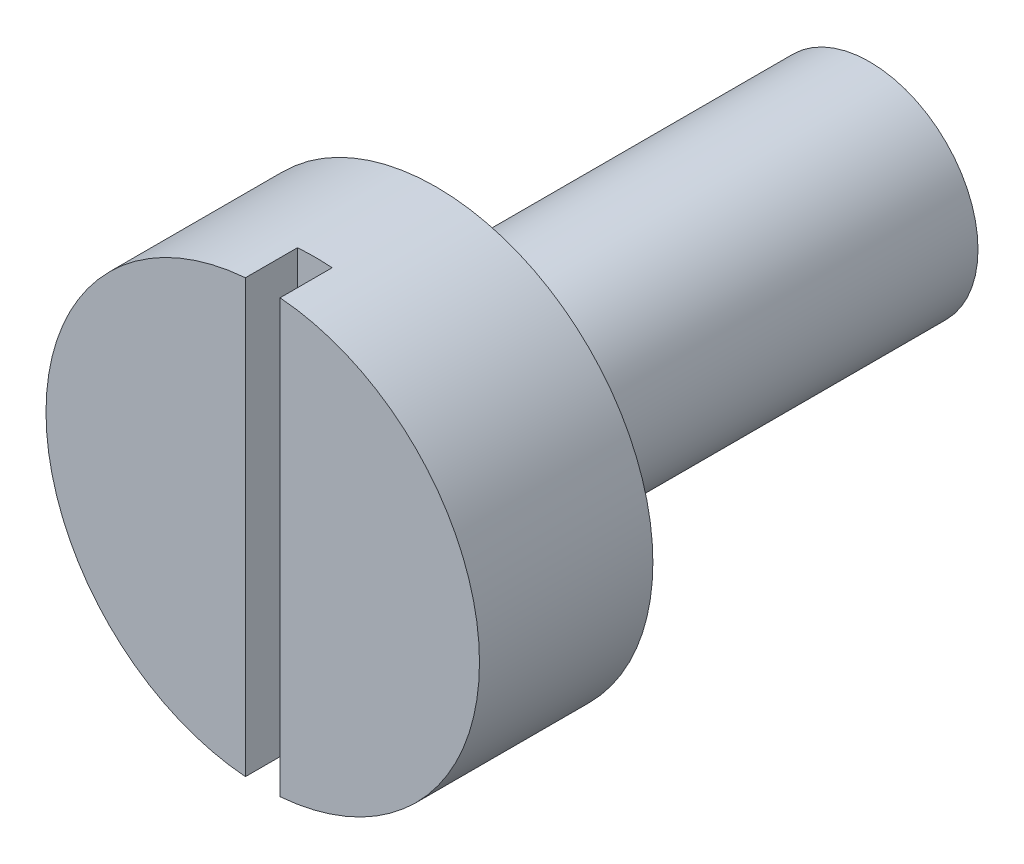
ISO-10303-21;
HEADER;
FILE_DESCRIPTION(('STEP AP214'),'2;1');
FILE_NAME('part.step','',(''),(''),'','','');
FILE_SCHEMA(('AUTOMOTIVE_DESIGN { 1 0 10303 214 1 1 1 1 }'));
ENDSEC;
DATA;
#1=APPLICATION_CONTEXT('core data for automotive mechanical design processes');
#2=APPLICATION_PROTOCOL_DEFINITION('international standard','automotive_design',2000,#1);
#3=PRODUCT_CONTEXT('',#1,'mechanical');
#4=PRODUCT('Part','Part','',(#3));
#5=PRODUCT_RELATED_PRODUCT_CATEGORY('part','',(#4));
#6=PRODUCT_DEFINITION_FORMATION('','',#4);
#7=PRODUCT_DEFINITION_CONTEXT('part definition',#1,'design');
#8=PRODUCT_DEFINITION('design','',#6,#7);
#9=PRODUCT_DEFINITION_SHAPE('','',#8);
#10=(LENGTH_UNIT() NAMED_UNIT(*) SI_UNIT(.MILLI.,.METRE.));
#11=(NAMED_UNIT(*) PLANE_ANGLE_UNIT() SI_UNIT($,.RADIAN.));
#12=(NAMED_UNIT(*) SI_UNIT($,.STERADIAN.) SOLID_ANGLE_UNIT());
#13=UNCERTAINTY_MEASURE_WITH_UNIT(LENGTH_MEASURE(1.E-05),#10,'distance_accuracy_value','');
#14=(GEOMETRIC_REPRESENTATION_CONTEXT(3) GLOBAL_UNCERTAINTY_ASSIGNED_CONTEXT((#13)) GLOBAL_UNIT_ASSIGNED_CONTEXT((#10,
#11,#12)) REPRESENTATION_CONTEXT('',''));
#15=CARTESIAN_POINT('',(0.,0.,0.));
#16=DIRECTION('',(0.,0.,1.));
#17=DIRECTION('',(1.,0.,0.));
#18=AXIS2_PLACEMENT_3D('',#15,#16,#17);
#19=CARTESIAN_POINT('',(0.,0.,9.));
#20=DIRECTION('',(0.,0.,1.));
#21=DIRECTION('',(1.,0.,0.));
#22=AXIS2_PLACEMENT_3D('',#19,#20,#21);
#23=PLANE('',#22);
#24=DIRECTION('',(0.,-1.,0.));
#25=VECTOR('',#24,1.);
#26=CARTESIAN_POINT('',(-0.4,0.,9.));
#27=LINE('',#26,#25);
#28=CARTESIAN_POINT('',(-0.400000000000002,4.98397431775084,9.));
#29=VERTEX_POINT('',#28);
#30=CARTESIAN_POINT('',(-0.399999999999999,-4.98397431775085,9.));
#31=VERTEX_POINT('',#30);
#32=EDGE_CURVE('E77',#29,#31,#27,.T.);
#33=ORIENTED_EDGE('',*,*,#32,.F.);
#34=CARTESIAN_POINT('',(0.,0.,9.));
#35=DIRECTION('',(0.,0.,1.));
#36=DIRECTION('',(1.,0.,0.));
#37=AXIS2_PLACEMENT_3D('',#34,#35,#36);
#38=CIRCLE('',#37,5.);
#39=EDGE_CURVE('E89',#29,#31,#38,.T.);
#40=ORIENTED_EDGE('',*,*,#39,.T.);
#41=EDGE_LOOP('',(#33,#40));
#42=FACE_BOUND('',#41,.T.);
#43=ADVANCED_FACE('F29',(#42),#23,.T.);
#44=CARTESIAN_POINT('',(0.,0.,5.));
#45=DIRECTION('',(0.,0.,-1.));
#46=DIRECTION('',(-1.,0.,0.));
#47=AXIS2_PLACEMENT_3D('',#44,#45,#46);
#48=CYLINDRICAL_SURFACE('',#47,2.5);
#49=CARTESIAN_POINT('',(0.,0.,5.));
#50=DIRECTION('',(0.,0.,1.));
#51=DIRECTION('',(1.,0.,0.));
#52=AXIS2_PLACEMENT_3D('',#49,#50,#51);
#53=CIRCLE('',#52,2.5);
#54=CARTESIAN_POINT('',(2.5,0.,5.));
#55=VERTEX_POINT('',#54);
#56=EDGE_CURVE('E78',#55,#55,#53,.T.);
#57=ORIENTED_EDGE('',*,*,#56,.F.);
#58=EDGE_LOOP('',(#57));
#59=FACE_BOUND('',#58,.T.);
#60=CARTESIAN_POINT('',(0.,0.,-5.));
#61=DIRECTION('',(0.,0.,1.));
#62=DIRECTION('',(1.,0.,0.));
#63=AXIS2_PLACEMENT_3D('',#60,#61,#62);
#64=CIRCLE('',#63,2.5);
#65=CARTESIAN_POINT('',(2.5,0.,-5.));
#66=VERTEX_POINT('',#65);
#67=EDGE_CURVE('E93',#66,#66,#64,.T.);
#68=ORIENTED_EDGE('',*,*,#67,.T.);
#69=EDGE_LOOP('',(#68));
#70=FACE_BOUND('',#69,.T.);
#71=ADVANCED_FACE('F31',(#59,#70),#48,.T.);
#72=CARTESIAN_POINT('',(0.,0.,-5.));
#73=DIRECTION('',(0.,0.,1.));
#74=DIRECTION('',(1.,0.,0.));
#75=AXIS2_PLACEMENT_3D('',#72,#73,#74);
#76=PLANE('',#75);
#77=ORIENTED_EDGE('',*,*,#67,.F.);
#78=EDGE_LOOP('',(#77));
#79=FACE_BOUND('',#78,.T.);
#80=ADVANCED_FACE('F118',(#79),#76,.F.);
#81=CARTESIAN_POINT('',(0.,0.,5.));
#82=DIRECTION('',(0.,0.,1.));
#83=DIRECTION('',(1.,0.,0.));
#84=AXIS2_PLACEMENT_3D('',#81,#82,#83);
#85=PLANE('',#84);
#86=CARTESIAN_POINT('',(0.,0.,5.));
#87=DIRECTION('',(0.,0.,1.));
#88=DIRECTION('',(1.,0.,0.));
#89=AXIS2_PLACEMENT_3D('',#86,#87,#88);
#90=CIRCLE('',#89,5.);
#91=CARTESIAN_POINT('',(5.,0.,5.));
#92=VERTEX_POINT('',#91);
#93=EDGE_CURVE('E90',#92,#92,#90,.T.);
#94=ORIENTED_EDGE('',*,*,#93,.F.);
#95=EDGE_LOOP('',(#94));
#96=FACE_BOUND('',#95,.T.);
#97=ORIENTED_EDGE('',*,*,#56,.T.);
#98=EDGE_LOOP('',(#97));
#99=FACE_BOUND('',#98,.T.);
#100=ADVANCED_FACE('F128',(#96,#99),#85,.F.);
#101=CARTESIAN_POINT('',(0.,0.,9.));
#102=DIRECTION('',(0.,0.,-1.));
#103=DIRECTION('',(-1.,0.,0.));
#104=AXIS2_PLACEMENT_3D('',#101,#102,#103);
#105=CYLINDRICAL_SURFACE('',#104,5.);
#106=ORIENTED_EDGE('',*,*,#39,.F.);
#107=DIRECTION('',(0.,0.,-1.));
#108=VECTOR('',#107,1.);
#109=CARTESIAN_POINT('',(-0.400000000000002,4.98397431775085,9.));
#110=LINE('',#109,#108);
#111=CARTESIAN_POINT('',(-0.400000000000002,4.98397431775084,7.8));
#112=VERTEX_POINT('',#111);
#113=EDGE_CURVE('E95',#29,#112,#110,.T.);
#114=ORIENTED_EDGE('',*,*,#113,.T.);
#115=CARTESIAN_POINT('',(0.,0.,7.8));
#116=DIRECTION('',(0.,0.,-1.));
#117=DIRECTION('',(-1.,0.,0.));
#118=AXIS2_PLACEMENT_3D('',#115,#116,#117);
#119=CIRCLE('',#118,5.);
#120=CARTESIAN_POINT('',(0.400000000000001,4.98397431775084,7.8));
#121=VERTEX_POINT('',#120);
#122=EDGE_CURVE('E11',#112,#121,#119,.T.);
#123=ORIENTED_EDGE('',*,*,#122,.T.);
#124=DIRECTION('',(0.,0.,-1.));
#125=VECTOR('',#124,1.);
#126=CARTESIAN_POINT('',(0.400000000000001,4.98397431775085,9.));
#127=LINE('',#126,#125);
#128=CARTESIAN_POINT('',(0.400000000000001,4.98397431775084,9.));
#129=VERTEX_POINT('',#128);
#130=EDGE_CURVE('E72',#121,#129,#127,.F.);
#131=ORIENTED_EDGE('',*,*,#130,.T.);
#132=CARTESIAN_POINT('',(0.400000000000001,-4.98397431775085,9.));
#133=VERTEX_POINT('',#132);
#134=EDGE_CURVE('E84',#133,#129,#38,.T.);
#135=ORIENTED_EDGE('',*,*,#134,.F.);
#136=DIRECTION('',(0.,0.,-1.));
#137=VECTOR('',#136,1.);
#138=CARTESIAN_POINT('',(0.400000000000001,-4.98397431775085,9.));
#139=LINE('',#138,#137);
#140=CARTESIAN_POINT('',(0.400000000000001,-4.98397431775084,7.8));
#141=VERTEX_POINT('',#140);
#142=EDGE_CURVE('E44',#133,#141,#139,.T.);
#143=ORIENTED_EDGE('',*,*,#142,.T.);
#144=CARTESIAN_POINT('',(-0.399999999999999,-4.98397431775084,7.8));
#145=VERTEX_POINT('',#144);
#146=EDGE_CURVE('E33',#141,#145,#119,.T.);
#147=ORIENTED_EDGE('',*,*,#146,.T.);
#148=DIRECTION('',(0.,0.,-1.));
#149=VECTOR('',#148,1.);
#150=CARTESIAN_POINT('',(-0.399999999999999,-4.98397431775085,9.));
#151=LINE('',#150,#149);
#152=EDGE_CURVE('E52',#145,#31,#151,.F.);
#153=ORIENTED_EDGE('',*,*,#152,.T.);
#154=EDGE_LOOP('',(#106,#114,#123,#131,#135,#143,#147,#153));
#155=FACE_BOUND('',#154,.T.);
#156=ORIENTED_EDGE('',*,*,#93,.T.);
#157=EDGE_LOOP('',(#156));
#158=FACE_BOUND('',#157,.T.);
#159=ADVANCED_FACE('F82',(#155,#158),#105,.T.);
#160=DIRECTION('',(0.,1.,0.));
#161=VECTOR('',#160,1.);
#162=CARTESIAN_POINT('',(0.400000000000001,0.,9.));
#163=LINE('',#162,#161);
#164=EDGE_CURVE('E69',#133,#129,#163,.T.);
#165=ORIENTED_EDGE('',*,*,#164,.F.);
#166=ORIENTED_EDGE('',*,*,#134,.T.);
#167=EDGE_LOOP('',(#165,#166));
#168=FACE_BOUND('',#167,.T.);
#169=ADVANCED_FACE('F88',(#168),#23,.T.);
#170=CARTESIAN_POINT('',(-0.399999999999999,-5.46612334920244,7.8));
#171=DIRECTION('',(0.,0.,-1.));
#172=DIRECTION('',(-1.,0.,0.));
#173=AXIS2_PLACEMENT_3D('',#170,#171,#172);
#174=PLANE('',#173);
#175=DIRECTION('',(0.,-1.,0.));
#176=VECTOR('',#175,1.);
#177=CARTESIAN_POINT('',(-0.399999999999999,-5.46612334920244,7.8));
#178=LINE('',#177,#176);
#179=EDGE_CURVE('E106',#112,#145,#178,.T.);
#180=ORIENTED_EDGE('',*,*,#179,.T.);
#181=ORIENTED_EDGE('',*,*,#146,.F.);
#182=DIRECTION('',(0.,1.,0.));
#183=VECTOR('',#182,1.);
#184=CARTESIAN_POINT('',(0.400000000000001,-5.46612334920244,7.8));
#185=LINE('',#184,#183);
#186=EDGE_CURVE('E86',#141,#121,#185,.T.);
#187=ORIENTED_EDGE('',*,*,#186,.T.);
#188=ORIENTED_EDGE('',*,*,#122,.F.);
#189=EDGE_LOOP('',(#180,#181,#187,#188));
#190=FACE_BOUND('',#189,.T.);
#191=ADVANCED_FACE('F105',(#190),#174,.F.);
#192=CARTESIAN_POINT('',(-0.399999999999999,-5.46612334920244,7.8));
#193=DIRECTION('',(-1.,0.,0.));
#194=DIRECTION('',(0.,-1.,0.));
#195=AXIS2_PLACEMENT_3D('',#192,#193,#194);
#196=PLANE('',#195);
#197=ORIENTED_EDGE('',*,*,#32,.T.);
#198=ORIENTED_EDGE('',*,*,#152,.F.);
#199=ORIENTED_EDGE('',*,*,#179,.F.);
#200=ORIENTED_EDGE('',*,*,#113,.F.);
#201=EDGE_LOOP('',(#197,#198,#199,#200));
#202=FACE_BOUND('',#201,.T.);
#203=ADVANCED_FACE('F111',(#202),#196,.F.);
#204=CARTESIAN_POINT('',(0.400000000000001,-5.46612334920244,7.8));
#205=DIRECTION('',(1.,0.,0.));
#206=DIRECTION('',(0.,0.,-1.));
#207=AXIS2_PLACEMENT_3D('',#204,#205,#206);
#208=PLANE('',#207);
#209=ORIENTED_EDGE('',*,*,#164,.T.);
#210=ORIENTED_EDGE('',*,*,#130,.F.);
#211=ORIENTED_EDGE('',*,*,#186,.F.);
#212=ORIENTED_EDGE('',*,*,#142,.F.);
#213=EDGE_LOOP('',(#209,#210,#211,#212));
#214=FACE_BOUND('',#213,.T.);
#215=ADVANCED_FACE('F71',(#214),#208,.F.);
#216=CLOSED_SHELL('',(#43,#71,#80,#100,#159,#169,#191,#203,#215));
#217=MANIFOLD_SOLID_BREP('B2',#216);
#218=ADVANCED_BREP_SHAPE_REPRESENTATION('',(#18,#217),#14);
#219=SHAPE_DEFINITION_REPRESENTATION(#9,#218);
ENDSEC;
END-ISO-10303-21;
